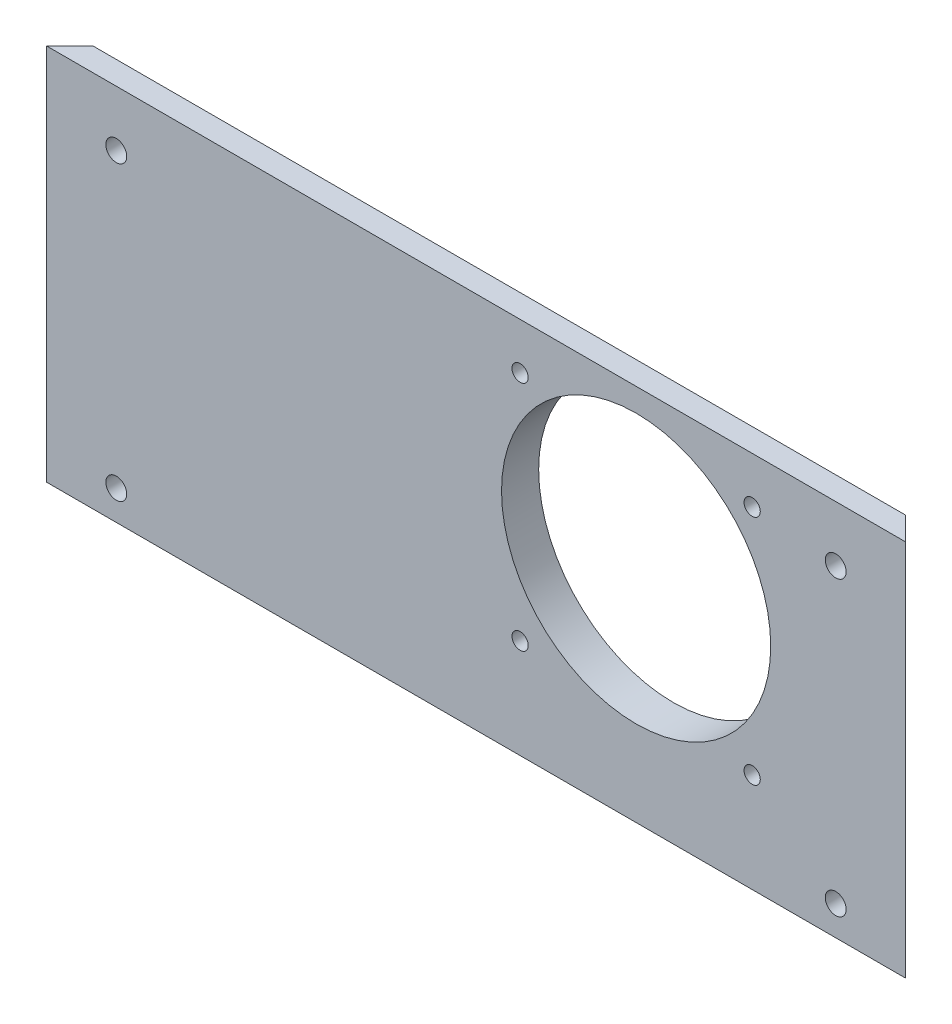
ISO-10303-21;
HEADER;
FILE_DESCRIPTION(('STEP AP214'),'2;1');
FILE_NAME('part.step','',(''),(''),'','','');
FILE_SCHEMA(('AUTOMOTIVE_DESIGN { 1 0 10303 214 1 1 1 1 }'));
ENDSEC;
DATA;
#1=APPLICATION_CONTEXT('core data for automotive mechanical design processes');
#2=APPLICATION_PROTOCOL_DEFINITION('international standard','automotive_design',2000,#1);
#3=PRODUCT_CONTEXT('',#1,'mechanical');
#4=PRODUCT('Part','Part','',(#3));
#5=PRODUCT_RELATED_PRODUCT_CATEGORY('part','',(#4));
#6=PRODUCT_DEFINITION_FORMATION('','',#4);
#7=PRODUCT_DEFINITION_CONTEXT('part definition',#1,'design');
#8=PRODUCT_DEFINITION('design','',#6,#7);
#9=PRODUCT_DEFINITION_SHAPE('','',#8);
#10=(LENGTH_UNIT() NAMED_UNIT(*) SI_UNIT(.MILLI.,.METRE.));
#11=(NAMED_UNIT(*) PLANE_ANGLE_UNIT() SI_UNIT($,.RADIAN.));
#12=(NAMED_UNIT(*) SI_UNIT($,.STERADIAN.) SOLID_ANGLE_UNIT());
#13=UNCERTAINTY_MEASURE_WITH_UNIT(LENGTH_MEASURE(1.E-05),#10,'distance_accuracy_value','');
#14=(GEOMETRIC_REPRESENTATION_CONTEXT(3) GLOBAL_UNCERTAINTY_ASSIGNED_CONTEXT((#13)) GLOBAL_UNIT_ASSIGNED_CONTEXT((#10,
#11,#12)) REPRESENTATION_CONTEXT('',''));
#15=CARTESIAN_POINT('',(0.,0.,0.));
#16=DIRECTION('',(0.,0.,1.));
#17=DIRECTION('',(1.,0.,0.));
#18=AXIS2_PLACEMENT_3D('',#15,#16,#17);
#19=CARTESIAN_POINT('',(0.,84.,-5.));
#20=DIRECTION('',(0.,1.,0.));
#21=DIRECTION('',(0.,0.,1.));
#22=AXIS2_PLACEMENT_3D('',#19,#20,#21);
#23=PLANE('',#22);
#24=DIRECTION('',(-0.707106781186546,0.,-0.707106781186549));
#25=VECTOR('',#24,1.);
#26=CARTESIAN_POINT('',(90.0000000000003,84.,-95.));
#27=LINE('',#26,#25);
#28=CARTESIAN_POINT('',(185.,84.,0.));
#29=VERTEX_POINT('',#28);
#30=CARTESIAN_POINT('',(180.,84.,-4.99999999999999));
#31=VERTEX_POINT('',#30);
#32=EDGE_CURVE('E130',#29,#31,#27,.T.);
#33=ORIENTED_EDGE('',*,*,#32,.T.);
#34=DIRECTION('',(-1.,0.,0.));
#35=VECTOR('',#34,1.);
#36=CARTESIAN_POINT('',(8.00000000000001,84.,-5.));
#37=LINE('',#36,#35);
#38=CARTESIAN_POINT('',(5.00000000000002,84.,-5.));
#39=VERTEX_POINT('',#38);
#40=EDGE_CURVE('E65',#31,#39,#37,.T.);
#41=ORIENTED_EDGE('',*,*,#40,.T.);
#42=DIRECTION('',(-0.707106781186546,0.,0.707106781186549));
#43=VECTOR('',#42,1.);
#44=CARTESIAN_POINT('',(2.50000000000002,84.,-2.49999999999999));
#45=LINE('',#44,#43);
#46=CARTESIAN_POINT('',(0.,84.,0.));
#47=VERTEX_POINT('',#46);
#48=EDGE_CURVE('E125',#39,#47,#45,.T.);
#49=ORIENTED_EDGE('',*,*,#48,.T.);
#50=DIRECTION('',(-1.,0.,0.));
#51=VECTOR('',#50,1.);
#52=CARTESIAN_POINT('',(0.,84.,0.));
#53=LINE('',#52,#51);
#54=EDGE_CURVE('E166',#29,#47,#53,.T.);
#55=ORIENTED_EDGE('',*,*,#54,.F.);
#56=EDGE_LOOP('',(#33,#41,#49,#55));
#57=FACE_BOUND('',#56,.T.);
#58=ADVANCED_FACE('F41',(#57),#23,.T.);
#59=CARTESIAN_POINT('',(0.,0.,-5.));
#60=DIRECTION('',(0.,0.,-1.));
#61=DIRECTION('',(-1.,0.,0.));
#62=AXIS2_PLACEMENT_3D('',#59,#60,#61);
#63=PLANE('',#62);
#64=DIRECTION('',(1.,0.,0.));
#65=VECTOR('',#64,1.);
#66=CARTESIAN_POINT('',(-4.99999999999998,2.59999999999997,-4.99999999999985));
#67=LINE('',#66,#65);
#68=CARTESIAN_POINT('',(4.99999999999987,2.59999999999997,-4.99999999999985));
#69=VERTEX_POINT('',#68);
#70=CARTESIAN_POINT('',(180.,2.59999999999997,-4.99999999999985));
#71=VERTEX_POINT('',#70);
#72=EDGE_CURVE('E100',#69,#71,#67,.T.);
#73=ORIENTED_EDGE('',*,*,#72,.F.);
#74=DIRECTION('',(0.,1.,0.));
#75=VECTOR('',#74,1.);
#76=CARTESIAN_POINT('',(5.00000000000002,0.,-5.));
#77=LINE('',#76,#75);
#78=CARTESIAN_POINT('',(5.00000000000002,5.,-5.));
#79=VERTEX_POINT('',#78);
#80=EDGE_CURVE('E126',#69,#79,#77,.T.);
#81=ORIENTED_EDGE('',*,*,#80,.T.);
#82=DIRECTION('',(-1.,0.,0.));
#83=VECTOR('',#82,1.);
#84=CARTESIAN_POINT('',(0.,5.,-5.));
#85=LINE('',#84,#83);
#86=CARTESIAN_POINT('',(180.,4.99999999999997,-5.));
#87=VERTEX_POINT('',#86);
#88=EDGE_CURVE('E123',#87,#79,#85,.T.);
#89=ORIENTED_EDGE('',*,*,#88,.F.);
#90=DIRECTION('',(0.,-1.,0.));
#91=VECTOR('',#90,1.);
#92=CARTESIAN_POINT('',(180.,0.,-5.));
#93=LINE('',#92,#91);
#94=EDGE_CURVE('E114',#87,#71,#93,.T.);
#95=ORIENTED_EDGE('',*,*,#94,.T.);
#96=EDGE_LOOP('',(#73,#81,#89,#95));
#97=FACE_BOUND('',#96,.T.);
#98=ADVANCED_FACE('F121',(#97),#63,.T.);
#99=CARTESIAN_POINT('',(0.,0.,0.));
#100=DIRECTION('',(0.,0.,-1.));
#101=DIRECTION('',(-1.,0.,0.));
#102=AXIS2_PLACEMENT_3D('',#99,#100,#101);
#103=PLANE('',#102);
#104=CARTESIAN_POINT('',(102.,24.,0.));
#105=DIRECTION('',(0.,0.,1.));
#106=DIRECTION('',(1.,0.,0.));
#107=AXIS2_PLACEMENT_3D('',#104,#105,#106);
#108=CIRCLE('',#107,1.75);
#109=CARTESIAN_POINT('',(103.75,24.,0.));
#110=VERTEX_POINT('',#109);
#111=EDGE_CURVE('E374',#110,#110,#108,.T.);
#112=ORIENTED_EDGE('',*,*,#111,.F.);
#113=EDGE_LOOP('',(#112));
#114=FACE_BOUND('',#113,.T.);
#115=CARTESIAN_POINT('',(152.,24.,0.));
#116=DIRECTION('',(0.,0.,1.));
#117=DIRECTION('',(1.,0.,0.));
#118=AXIS2_PLACEMENT_3D('',#115,#116,#117);
#119=CIRCLE('',#118,1.75000000000001);
#120=CARTESIAN_POINT('',(153.75,24.,0.));
#121=VERTEX_POINT('',#120);
#122=EDGE_CURVE('E378',#121,#121,#119,.T.);
#123=ORIENTED_EDGE('',*,*,#122,.F.);
#124=EDGE_LOOP('',(#123));
#125=FACE_BOUND('',#124,.T.);
#126=CARTESIAN_POINT('',(152.,74.,0.));
#127=DIRECTION('',(0.,0.,1.));
#128=DIRECTION('',(1.,0.,0.));
#129=AXIS2_PLACEMENT_3D('',#126,#127,#128);
#130=CIRCLE('',#129,1.75000000000001);
#131=CARTESIAN_POINT('',(153.75,74.,0.));
#132=VERTEX_POINT('',#131);
#133=EDGE_CURVE('E404',#132,#132,#130,.T.);
#134=ORIENTED_EDGE('',*,*,#133,.F.);
#135=EDGE_LOOP('',(#134));
#136=FACE_BOUND('',#135,.T.);
#137=CARTESIAN_POINT('',(102.,74.,0.));
#138=DIRECTION('',(0.,0.,1.));
#139=DIRECTION('',(1.,0.,0.));
#140=AXIS2_PLACEMENT_3D('',#137,#138,#139);
#141=CIRCLE('',#140,1.75);
#142=CARTESIAN_POINT('',(103.75,74.,0.));
#143=VERTEX_POINT('',#142);
#144=EDGE_CURVE('E392',#143,#143,#141,.T.);
#145=ORIENTED_EDGE('',*,*,#144,.F.);
#146=EDGE_LOOP('',(#145));
#147=FACE_BOUND('',#146,.T.);
#148=CARTESIAN_POINT('',(127.,50.,0.));
#149=DIRECTION('',(0.,0.,1.));
#150=DIRECTION('',(1.,0.,0.));
#151=AXIS2_PLACEMENT_3D('',#148,#149,#150);
#152=CIRCLE('',#151,29.);
#153=CARTESIAN_POINT('',(156.,50.,0.));
#154=VERTEX_POINT('',#153);
#155=EDGE_CURVE('E384',#154,#154,#152,.T.);
#156=ORIENTED_EDGE('',*,*,#155,.F.);
#157=EDGE_LOOP('',(#156));
#158=FACE_BOUND('',#157,.T.);
#159=CARTESIAN_POINT('',(170.,72.,0.));
#160=DIRECTION('',(0.,0.,1.));
#161=DIRECTION('',(-1.,0.,0.));
#162=AXIS2_PLACEMENT_3D('',#159,#160,#161);
#163=CIRCLE('',#162,2.25000000000004);
#164=CARTESIAN_POINT('',(167.75,72.,0.));
#165=VERTEX_POINT('',#164);
#166=EDGE_CURVE('E187',#165,#165,#163,.T.);
#167=ORIENTED_EDGE('',*,*,#166,.F.);
#168=EDGE_LOOP('',(#167));
#169=FACE_BOUND('',#168,.T.);
#170=CARTESIAN_POINT('',(15.,72.,0.));
#171=DIRECTION('',(0.,0.,1.));
#172=DIRECTION('',(1.,0.,0.));
#173=AXIS2_PLACEMENT_3D('',#170,#171,#172);
#174=CIRCLE('',#173,2.25000000000001);
#175=CARTESIAN_POINT('',(17.25,72.,0.));
#176=VERTEX_POINT('',#175);
#177=EDGE_CURVE('E192',#176,#176,#174,.T.);
#178=ORIENTED_EDGE('',*,*,#177,.F.);
#179=EDGE_LOOP('',(#178));
#180=FACE_BOUND('',#179,.T.);
#181=CARTESIAN_POINT('',(170.,9.,0.));
#182=DIRECTION('',(0.,0.,1.));
#183=DIRECTION('',(-1.,0.,0.));
#184=AXIS2_PLACEMENT_3D('',#181,#182,#183);
#185=CIRCLE('',#184,2.25000000000004);
#186=CARTESIAN_POINT('',(167.75,9.,0.));
#187=VERTEX_POINT('',#186);
#188=EDGE_CURVE('E202',#187,#187,#185,.T.);
#189=ORIENTED_EDGE('',*,*,#188,.F.);
#190=EDGE_LOOP('',(#189));
#191=FACE_BOUND('',#190,.T.);
#192=CARTESIAN_POINT('',(15.,9.,0.));
#193=DIRECTION('',(0.,0.,1.));
#194=DIRECTION('',(1.,0.,0.));
#195=AXIS2_PLACEMENT_3D('',#192,#193,#194);
#196=CIRCLE('',#195,2.25);
#197=CARTESIAN_POINT('',(17.25,9.,0.));
#198=VERTEX_POINT('',#197);
#199=EDGE_CURVE('E206',#198,#198,#196,.T.);
#200=ORIENTED_EDGE('',*,*,#199,.F.);
#201=EDGE_LOOP('',(#200));
#202=FACE_BOUND('',#201,.T.);
#203=DIRECTION('',(0.,-1.,0.));
#204=VECTOR('',#203,1.);
#205=CARTESIAN_POINT('',(0.,0.,0.));
#206=LINE('',#205,#204);
#207=CARTESIAN_POINT('',(0.,2.59999999999997,0.));
#208=VERTEX_POINT('',#207);
#209=EDGE_CURVE('E175',#47,#208,#206,.T.);
#210=ORIENTED_EDGE('',*,*,#209,.T.);
#211=DIRECTION('',(1.,0.,0.));
#212=VECTOR('',#211,1.);
#213=CARTESIAN_POINT('',(0.,2.59999999999997,1.66533453693773E-13));
#214=LINE('',#213,#212);
#215=CARTESIAN_POINT('',(185.,2.59999999999997,1.66533453693773E-13));
#216=VERTEX_POINT('',#215);
#217=EDGE_CURVE('E57',#208,#216,#214,.T.);
#218=ORIENTED_EDGE('',*,*,#217,.T.);
#219=DIRECTION('',(0.,1.,0.));
#220=VECTOR('',#219,1.);
#221=CARTESIAN_POINT('',(185.,0.,0.));
#222=LINE('',#221,#220);
#223=EDGE_CURVE('E116',#216,#29,#222,.T.);
#224=ORIENTED_EDGE('',*,*,#223,.T.);
#225=ORIENTED_EDGE('',*,*,#54,.T.);
#226=EDGE_LOOP('',(#210,#218,#224,#225));
#227=FACE_BOUND('',#226,.T.);
#228=ADVANCED_FACE('F210',(#114,#125,#136,#147,#158,#169,#180,#191,#202,#227),#103,.F.);
#229=CARTESIAN_POINT('',(15.,9.,-5.));
#230=DIRECTION('',(0.,0.,1.));
#231=DIRECTION('',(1.,0.,0.));
#232=AXIS2_PLACEMENT_3D('',#229,#230,#231);
#233=CYLINDRICAL_SURFACE('',#232,2.25);
#234=ORIENTED_EDGE('',*,*,#199,.T.);
#235=EDGE_LOOP('',(#234));
#236=FACE_BOUND('',#235,.T.);
#237=CARTESIAN_POINT('',(15.,9.,-8.));
#238=DIRECTION('',(0.,0.,-1.));
#239=DIRECTION('',(-1.,0.,0.));
#240=AXIS2_PLACEMENT_3D('',#237,#238,#239);
#241=CIRCLE('',#240,2.25);
#242=CARTESIAN_POINT('',(12.75,9.,-8.));
#243=VERTEX_POINT('',#242);
#244=EDGE_CURVE('E222',#243,#243,#241,.T.);
#245=ORIENTED_EDGE('',*,*,#244,.T.);
#246=EDGE_LOOP('',(#245));
#247=FACE_BOUND('',#246,.T.);
#248=ADVANCED_FACE('F313',(#236,#247),#233,.F.);
#249=CARTESIAN_POINT('',(170.,9.,-5.));
#250=DIRECTION('',(0.,0.,1.));
#251=DIRECTION('',(1.,0.,0.));
#252=AXIS2_PLACEMENT_3D('',#249,#250,#251);
#253=CYLINDRICAL_SURFACE('',#252,2.25000000000004);
#254=ORIENTED_EDGE('',*,*,#188,.T.);
#255=EDGE_LOOP('',(#254));
#256=FACE_BOUND('',#255,.T.);
#257=CARTESIAN_POINT('',(170.,9.,-8.));
#258=DIRECTION('',(0.,0.,-1.));
#259=DIRECTION('',(-1.,0.,0.));
#260=AXIS2_PLACEMENT_3D('',#257,#258,#259);
#261=CIRCLE('',#260,2.25000000000004);
#262=CARTESIAN_POINT('',(167.75,9.,-8.));
#263=VERTEX_POINT('',#262);
#264=EDGE_CURVE('E216',#263,#263,#261,.T.);
#265=ORIENTED_EDGE('',*,*,#264,.T.);
#266=EDGE_LOOP('',(#265));
#267=FACE_BOUND('',#266,.T.);
#268=ADVANCED_FACE('F248',(#256,#267),#253,.F.);
#269=CARTESIAN_POINT('',(15.,72.,-5.));
#270=DIRECTION('',(0.,0.,1.));
#271=DIRECTION('',(1.,0.,0.));
#272=AXIS2_PLACEMENT_3D('',#269,#270,#271);
#273=CYLINDRICAL_SURFACE('',#272,2.25000000000001);
#274=ORIENTED_EDGE('',*,*,#177,.T.);
#275=EDGE_LOOP('',(#274));
#276=FACE_BOUND('',#275,.T.);
#277=CARTESIAN_POINT('',(15.,72.,-8.));
#278=DIRECTION('',(0.,0.,-1.));
#279=DIRECTION('',(-1.,0.,0.));
#280=AXIS2_PLACEMENT_3D('',#277,#278,#279);
#281=CIRCLE('',#280,2.25000000000001);
#282=CARTESIAN_POINT('',(12.75,72.,-8.));
#283=VERTEX_POINT('',#282);
#284=EDGE_CURVE('E194',#283,#283,#281,.T.);
#285=ORIENTED_EDGE('',*,*,#284,.T.);
#286=EDGE_LOOP('',(#285));
#287=FACE_BOUND('',#286,.T.);
#288=ADVANCED_FACE('F231',(#276,#287),#273,.F.);
#289=CARTESIAN_POINT('',(170.,72.,-5.));
#290=DIRECTION('',(0.,0.,1.));
#291=DIRECTION('',(1.,0.,0.));
#292=AXIS2_PLACEMENT_3D('',#289,#290,#291);
#293=CYLINDRICAL_SURFACE('',#292,2.25000000000004);
#294=ORIENTED_EDGE('',*,*,#166,.T.);
#295=EDGE_LOOP('',(#294));
#296=FACE_BOUND('',#295,.T.);
#297=CARTESIAN_POINT('',(170.,72.,-8.));
#298=DIRECTION('',(0.,0.,-1.));
#299=DIRECTION('',(-1.,0.,0.));
#300=AXIS2_PLACEMENT_3D('',#297,#298,#299);
#301=CIRCLE('',#300,2.25000000000004);
#302=CARTESIAN_POINT('',(167.75,72.,-8.));
#303=VERTEX_POINT('',#302);
#304=EDGE_CURVE('E212',#303,#303,#301,.T.);
#305=ORIENTED_EDGE('',*,*,#304,.T.);
#306=EDGE_LOOP('',(#305));
#307=FACE_BOUND('',#306,.T.);
#308=ADVANCED_FACE('F234',(#296,#307),#293,.F.);
#309=CARTESIAN_POINT('',(0.,0.,-8.));
#310=DIRECTION('',(0.,0.,1.));
#311=DIRECTION('',(1.,0.,0.));
#312=AXIS2_PLACEMENT_3D('',#309,#310,#311);
#313=PLANE('',#312);
#314=CARTESIAN_POINT('',(102.,24.,-8.));
#315=DIRECTION('',(0.,0.,1.));
#316=DIRECTION('',(1.,0.,0.));
#317=AXIS2_PLACEMENT_3D('',#314,#315,#316);
#318=CIRCLE('',#317,1.75);
#319=CARTESIAN_POINT('',(103.75,24.,-8.));
#320=VERTEX_POINT('',#319);
#321=EDGE_CURVE('E371',#320,#320,#318,.T.);
#322=ORIENTED_EDGE('',*,*,#321,.T.);
#323=EDGE_LOOP('',(#322));
#324=FACE_BOUND('',#323,.T.);
#325=CARTESIAN_POINT('',(152.,24.,-8.));
#326=DIRECTION('',(0.,0.,1.));
#327=DIRECTION('',(1.,0.,0.));
#328=AXIS2_PLACEMENT_3D('',#325,#326,#327);
#329=CIRCLE('',#328,1.75000000000001);
#330=CARTESIAN_POINT('',(153.75,24.,-8.));
#331=VERTEX_POINT('',#330);
#332=EDGE_CURVE('E408',#331,#331,#329,.T.);
#333=ORIENTED_EDGE('',*,*,#332,.T.);
#334=EDGE_LOOP('',(#333));
#335=FACE_BOUND('',#334,.T.);
#336=CARTESIAN_POINT('',(152.,74.,-8.));
#337=DIRECTION('',(0.,0.,1.));
#338=DIRECTION('',(1.,0.,0.));
#339=AXIS2_PLACEMENT_3D('',#336,#337,#338);
#340=CIRCLE('',#339,1.75000000000001);
#341=CARTESIAN_POINT('',(153.75,74.,-8.));
#342=VERTEX_POINT('',#341);
#343=EDGE_CURVE('E398',#342,#342,#340,.T.);
#344=ORIENTED_EDGE('',*,*,#343,.T.);
#345=EDGE_LOOP('',(#344));
#346=FACE_BOUND('',#345,.T.);
#347=CARTESIAN_POINT('',(102.,74.,-8.));
#348=DIRECTION('',(0.,0.,1.));
#349=DIRECTION('',(1.,0.,0.));
#350=AXIS2_PLACEMENT_3D('',#347,#348,#349);
#351=CIRCLE('',#350,1.75);
#352=CARTESIAN_POINT('',(103.75,74.,-8.));
#353=VERTEX_POINT('',#352);
#354=EDGE_CURVE('E387',#353,#353,#351,.T.);
#355=ORIENTED_EDGE('',*,*,#354,.T.);
#356=EDGE_LOOP('',(#355));
#357=FACE_BOUND('',#356,.T.);
#358=CARTESIAN_POINT('',(127.,50.,-8.));
#359=DIRECTION('',(0.,0.,1.));
#360=DIRECTION('',(1.,0.,0.));
#361=AXIS2_PLACEMENT_3D('',#358,#359,#360);
#362=CIRCLE('',#361,29.);
#363=CARTESIAN_POINT('',(156.,50.,-8.));
#364=VERTEX_POINT('',#363);
#365=EDGE_CURVE('E118',#364,#364,#362,.T.);
#366=ORIENTED_EDGE('',*,*,#365,.T.);
#367=EDGE_LOOP('',(#366));
#368=FACE_BOUND('',#367,.T.);
#369=DIRECTION('',(0.,1.,0.));
#370=VECTOR('',#369,1.);
#371=CARTESIAN_POINT('',(8.00000000000001,84.,-8.));
#372=LINE('',#371,#370);
#373=CARTESIAN_POINT('',(8.00000000000001,5.,-8.));
#374=VERTEX_POINT('',#373);
#375=CARTESIAN_POINT('',(8.00000000000001,81.,-8.));
#376=VERTEX_POINT('',#375);
#377=EDGE_CURVE('E153',#374,#376,#372,.T.);
#378=ORIENTED_EDGE('',*,*,#377,.T.);
#379=DIRECTION('',(1.,0.,0.));
#380=VECTOR('',#379,1.);
#381=CARTESIAN_POINT('',(177.,81.,-8.));
#382=LINE('',#381,#380);
#383=CARTESIAN_POINT('',(177.,81.,-8.));
#384=VERTEX_POINT('',#383);
#385=EDGE_CURVE('E138',#376,#384,#382,.T.);
#386=ORIENTED_EDGE('',*,*,#385,.T.);
#387=DIRECTION('',(0.,-1.,0.));
#388=VECTOR('',#387,1.);
#389=CARTESIAN_POINT('',(177.,4.99999999999997,-8.));
#390=LINE('',#389,#388);
#391=CARTESIAN_POINT('',(177.,4.99999999999997,-8.));
#392=VERTEX_POINT('',#391);
#393=EDGE_CURVE('E165',#384,#392,#390,.T.);
#394=ORIENTED_EDGE('',*,*,#393,.T.);
#395=DIRECTION('',(-1.,0.,0.));
#396=VECTOR('',#395,1.);
#397=CARTESIAN_POINT('',(0.,5.,-8.));
#398=LINE('',#397,#396);
#399=EDGE_CURVE('E163',#392,#374,#398,.T.);
#400=ORIENTED_EDGE('',*,*,#399,.T.);
#401=EDGE_LOOP('',(#378,#386,#394,#400));
#402=FACE_BOUND('',#401,.T.);
#403=ORIENTED_EDGE('',*,*,#284,.F.);
#404=EDGE_LOOP('',(#403));
#405=FACE_BOUND('',#404,.T.);
#406=ORIENTED_EDGE('',*,*,#244,.F.);
#407=EDGE_LOOP('',(#406));
#408=FACE_BOUND('',#407,.T.);
#409=ORIENTED_EDGE('',*,*,#264,.F.);
#410=EDGE_LOOP('',(#409));
#411=FACE_BOUND('',#410,.T.);
#412=ORIENTED_EDGE('',*,*,#304,.F.);
#413=EDGE_LOOP('',(#412));
#414=FACE_BOUND('',#413,.T.);
#415=ADVANCED_FACE('F159',(#324,#335,#346,#357,#368,#402,#405,#408,#411,#414),#313,.F.);
#416=CARTESIAN_POINT('',(0.,5.,-8.));
#417=DIRECTION('',(0.,1.,0.));
#418=DIRECTION('',(-1.,0.,0.));
#419=AXIS2_PLACEMENT_3D('',#416,#417,#418);
#420=PLANE('',#419);
#421=ORIENTED_EDGE('',*,*,#399,.F.);
#422=DIRECTION('',(0.707106781186546,0.,0.707106781186549));
#423=VECTOR('',#422,1.);
#424=CARTESIAN_POINT('',(177.,4.99999999999997,-8.));
#425=LINE('',#424,#423);
#426=EDGE_CURVE('E132',#392,#87,#425,.T.);
#427=ORIENTED_EDGE('',*,*,#426,.T.);
#428=ORIENTED_EDGE('',*,*,#88,.T.);
#429=DIRECTION('',(0.707106781186546,0.,-0.707106781186549));
#430=VECTOR('',#429,1.);
#431=CARTESIAN_POINT('',(8.00000000000001,5.,-8.));
#432=LINE('',#431,#430);
#433=EDGE_CURVE('E181',#79,#374,#432,.T.);
#434=ORIENTED_EDGE('',*,*,#433,.T.);
#435=EDGE_LOOP('',(#421,#427,#428,#434));
#436=FACE_BOUND('',#435,.T.);
#437=ADVANCED_FACE('F185',(#436),#420,.F.);
#438=CARTESIAN_POINT('',(177.,0.,-8.));
#439=DIRECTION('',(0.707106781186549,0.,-0.707106781186546));
#440=DIRECTION('',(0.,1.,0.));
#441=AXIS2_PLACEMENT_3D('',#438,#439,#440);
#442=PLANE('',#441);
#443=DIRECTION('',(0.707106781186545,0.,0.70710678118655));
#444=VECTOR('',#443,1.);
#445=CARTESIAN_POINT('',(185.,2.59999999999997,1.66533453693773E-13));
#446=LINE('',#445,#444);
#447=EDGE_CURVE('E103',#71,#216,#446,.T.);
#448=ORIENTED_EDGE('',*,*,#447,.F.);
#449=ORIENTED_EDGE('',*,*,#94,.F.);
#450=ORIENTED_EDGE('',*,*,#426,.F.);
#451=ORIENTED_EDGE('',*,*,#393,.F.);
#452=DIRECTION('',(0.577350269189624,0.577350269189627,0.577350269189626));
#453=VECTOR('',#452,1.);
#454=CARTESIAN_POINT('',(150.,53.9999999999999,-35.0000000000001));
#455=LINE('',#454,#453);
#456=EDGE_CURVE('E142',#384,#31,#455,.T.);
#457=ORIENTED_EDGE('',*,*,#456,.T.);
#458=ORIENTED_EDGE('',*,*,#32,.F.);
#459=ORIENTED_EDGE('',*,*,#223,.F.);
#460=EDGE_LOOP('',(#448,#449,#450,#451,#457,#458,#459));
#461=FACE_BOUND('',#460,.T.);
#462=ADVANCED_FACE('F112',(#461),#442,.T.);
#463=CARTESIAN_POINT('',(8.00000000000001,0.,-8.));
#464=DIRECTION('',(-0.707106781186549,0.,-0.707106781186546));
#465=DIRECTION('',(0.,-1.,0.));
#466=AXIS2_PLACEMENT_3D('',#463,#464,#465);
#467=PLANE('',#466);
#468=DIRECTION('',(0.707106781186546,0.,-0.707106781186549));
#469=VECTOR('',#468,1.);
#470=CARTESIAN_POINT('',(8.00000000000001,2.59999999999997,-8.));
#471=LINE('',#470,#469);
#472=EDGE_CURVE('E11',#208,#69,#471,.T.);
#473=ORIENTED_EDGE('',*,*,#472,.F.);
#474=ORIENTED_EDGE('',*,*,#209,.F.);
#475=ORIENTED_EDGE('',*,*,#48,.F.);
#476=DIRECTION('',(0.577350269189624,-0.577350269189627,-0.577350269189626));
#477=VECTOR('',#476,1.);
#478=CARTESIAN_POINT('',(35.,53.9999999999999,-35.0000000000001));
#479=LINE('',#478,#477);
#480=EDGE_CURVE('E51',#39,#376,#479,.T.);
#481=ORIENTED_EDGE('',*,*,#480,.T.);
#482=ORIENTED_EDGE('',*,*,#377,.F.);
#483=ORIENTED_EDGE('',*,*,#433,.F.);
#484=ORIENTED_EDGE('',*,*,#80,.F.);
#485=EDGE_LOOP('',(#473,#474,#475,#481,#482,#483,#484));
#486=FACE_BOUND('',#485,.T.);
#487=ADVANCED_FACE('F151',(#486),#467,.T.);
#488=CARTESIAN_POINT('',(0.,81.,-8.));
#489=DIRECTION('',(0.,0.707106781186547,-0.707106781186548));
#490=DIRECTION('',(-1.,0.,0.));
#491=AXIS2_PLACEMENT_3D('',#488,#489,#490);
#492=PLANE('',#491);
#493=ORIENTED_EDGE('',*,*,#480,.F.);
#494=ORIENTED_EDGE('',*,*,#40,.F.);
#495=ORIENTED_EDGE('',*,*,#456,.F.);
#496=ORIENTED_EDGE('',*,*,#385,.F.);
#497=EDGE_LOOP('',(#493,#494,#495,#496));
#498=FACE_BOUND('',#497,.T.);
#499=ADVANCED_FACE('F44',(#498),#492,.T.);
#500=CARTESIAN_POINT('',(0.,2.59999999999997,1.66533453693773E-13));
#501=DIRECTION('',(0.,1.,0.));
#502=DIRECTION('',(-1.,0.,0.));
#503=AXIS2_PLACEMENT_3D('',#500,#501,#502);
#504=PLANE('',#503);
#505=ORIENTED_EDGE('',*,*,#472,.T.);
#506=ORIENTED_EDGE('',*,*,#72,.T.);
#507=ORIENTED_EDGE('',*,*,#447,.T.);
#508=ORIENTED_EDGE('',*,*,#217,.F.);
#509=EDGE_LOOP('',(#505,#506,#507,#508));
#510=FACE_BOUND('',#509,.T.);
#511=ADVANCED_FACE('F102',(#510),#504,.F.);
#512=CARTESIAN_POINT('',(127.,50.,-8.));
#513=DIRECTION('',(0.,0.,1.));
#514=DIRECTION('',(1.,0.,0.));
#515=AXIS2_PLACEMENT_3D('',#512,#513,#514);
#516=CYLINDRICAL_SURFACE('',#515,29.);
#517=ORIENTED_EDGE('',*,*,#365,.F.);
#518=EDGE_LOOP('',(#517));
#519=FACE_BOUND('',#518,.T.);
#520=ORIENTED_EDGE('',*,*,#155,.T.);
#521=EDGE_LOOP('',(#520));
#522=FACE_BOUND('',#521,.T.);
#523=ADVANCED_FACE('F274',(#519,#522),#516,.F.);
#524=CARTESIAN_POINT('',(102.,74.,-8.));
#525=DIRECTION('',(0.,0.,1.));
#526=DIRECTION('',(1.,0.,0.));
#527=AXIS2_PLACEMENT_3D('',#524,#525,#526);
#528=CYLINDRICAL_SURFACE('',#527,1.75);
#529=ORIENTED_EDGE('',*,*,#354,.F.);
#530=EDGE_LOOP('',(#529));
#531=FACE_BOUND('',#530,.T.);
#532=ORIENTED_EDGE('',*,*,#144,.T.);
#533=EDGE_LOOP('',(#532));
#534=FACE_BOUND('',#533,.T.);
#535=ADVANCED_FACE('F279',(#531,#534),#528,.F.);
#536=CARTESIAN_POINT('',(152.,74.,-8.));
#537=DIRECTION('',(0.,0.,1.));
#538=DIRECTION('',(1.,0.,0.));
#539=AXIS2_PLACEMENT_3D('',#536,#537,#538);
#540=CYLINDRICAL_SURFACE('',#539,1.75000000000001);
#541=ORIENTED_EDGE('',*,*,#343,.F.);
#542=EDGE_LOOP('',(#541));
#543=FACE_BOUND('',#542,.T.);
#544=ORIENTED_EDGE('',*,*,#133,.T.);
#545=EDGE_LOOP('',(#544));
#546=FACE_BOUND('',#545,.T.);
#547=ADVANCED_FACE('F335',(#543,#546),#540,.F.);
#548=CARTESIAN_POINT('',(152.,24.,-8.));
#549=DIRECTION('',(0.,0.,1.));
#550=DIRECTION('',(1.,0.,0.));
#551=AXIS2_PLACEMENT_3D('',#548,#549,#550);
#552=CYLINDRICAL_SURFACE('',#551,1.75000000000001);
#553=ORIENTED_EDGE('',*,*,#332,.F.);
#554=EDGE_LOOP('',(#553));
#555=FACE_BOUND('',#554,.T.);
#556=ORIENTED_EDGE('',*,*,#122,.T.);
#557=EDGE_LOOP('',(#556));
#558=FACE_BOUND('',#557,.T.);
#559=ADVANCED_FACE('F345',(#555,#558),#552,.F.);
#560=CARTESIAN_POINT('',(102.,24.,-8.));
#561=DIRECTION('',(0.,0.,1.));
#562=DIRECTION('',(1.,0.,0.));
#563=AXIS2_PLACEMENT_3D('',#560,#561,#562);
#564=CYLINDRICAL_SURFACE('',#563,1.75);
#565=ORIENTED_EDGE('',*,*,#321,.F.);
#566=EDGE_LOOP('',(#565));
#567=FACE_BOUND('',#566,.T.);
#568=ORIENTED_EDGE('',*,*,#111,.T.);
#569=EDGE_LOOP('',(#568));
#570=FACE_BOUND('',#569,.T.);
#571=ADVANCED_FACE('F355',(#567,#570),#564,.F.);
#572=CLOSED_SHELL('',(#58,#98,#228,#248,#268,#288,#308,#415,#437,#462,#487,#499,#511,#523,#535,
#547,#559,#571));
#573=MANIFOLD_SOLID_BREP('B2',#572);
#574=ADVANCED_BREP_SHAPE_REPRESENTATION('',(#18,#573),#14);
#575=SHAPE_DEFINITION_REPRESENTATION(#9,#574);
ENDSEC;
END-ISO-10303-21;
